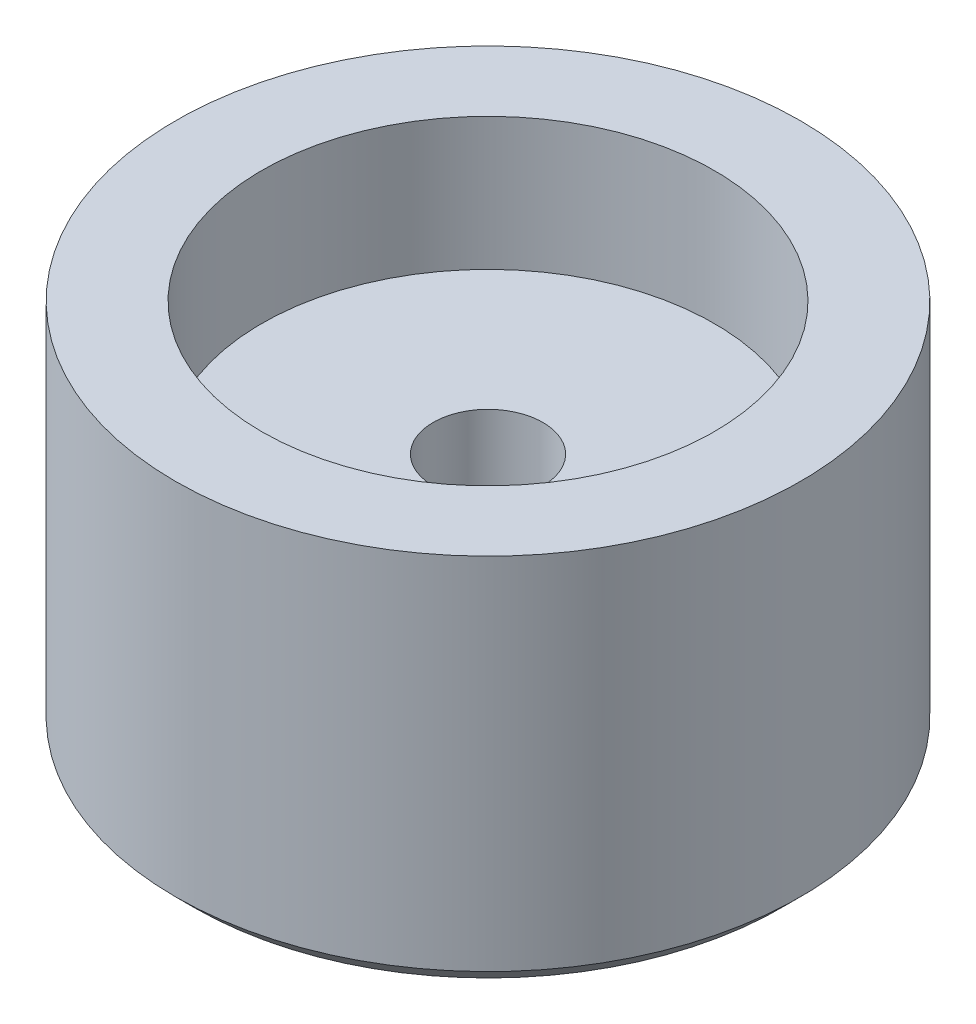
ISO-10303-21;
HEADER;
FILE_DESCRIPTION(('STEP AP214'),'2;1');
FILE_NAME('part.step','',(''),(''),'','','');
FILE_SCHEMA(('AUTOMOTIVE_DESIGN { 1 0 10303 214 1 1 1 1 }'));
ENDSEC;
DATA;
#1=APPLICATION_CONTEXT('core data for automotive mechanical design processes');
#2=APPLICATION_PROTOCOL_DEFINITION('international standard','automotive_design',2000,#1);
#3=PRODUCT_CONTEXT('',#1,'mechanical');
#4=PRODUCT('Part','Part','',(#3));
#5=PRODUCT_RELATED_PRODUCT_CATEGORY('part','',(#4));
#6=PRODUCT_DEFINITION_FORMATION('','',#4);
#7=PRODUCT_DEFINITION_CONTEXT('part definition',#1,'design');
#8=PRODUCT_DEFINITION('design','',#6,#7);
#9=PRODUCT_DEFINITION_SHAPE('','',#8);
#10=(LENGTH_UNIT() NAMED_UNIT(*) SI_UNIT(.MILLI.,.METRE.));
#11=(NAMED_UNIT(*) PLANE_ANGLE_UNIT() SI_UNIT($,.RADIAN.));
#12=(NAMED_UNIT(*) SI_UNIT($,.STERADIAN.) SOLID_ANGLE_UNIT());
#13=UNCERTAINTY_MEASURE_WITH_UNIT(LENGTH_MEASURE(1.E-05),#10,'distance_accuracy_value','');
#14=(GEOMETRIC_REPRESENTATION_CONTEXT(3) GLOBAL_UNCERTAINTY_ASSIGNED_CONTEXT((#13)) GLOBAL_UNIT_ASSIGNED_CONTEXT((#10,
#11,#12)) REPRESENTATION_CONTEXT('',''));
#15=CARTESIAN_POINT('',(0.,0.,0.));
#16=DIRECTION('',(0.,0.,1.));
#17=DIRECTION('',(1.,0.,0.));
#18=AXIS2_PLACEMENT_3D('',#15,#16,#17);
#19=CARTESIAN_POINT('',(0.,10.,0.));
#20=DIRECTION('',(0.,-1.,0.));
#21=DIRECTION('',(0.,0.,-1.));
#22=AXIS2_PLACEMENT_3D('',#19,#20,#21);
#23=CYLINDRICAL_SURFACE('',#22,1.45);
#24=CARTESIAN_POINT('',(0.,0.,0.));
#25=DIRECTION('',(0.,1.,0.));
#26=DIRECTION('',(0.,0.,1.));
#27=AXIS2_PLACEMENT_3D('',#24,#25,#26);
#28=CIRCLE('',#27,1.45);
#29=CARTESIAN_POINT('',(0.,0.,1.45));
#30=VERTEX_POINT('',#29);
#31=EDGE_CURVE('E64',#30,#30,#28,.T.);
#32=ORIENTED_EDGE('',*,*,#31,.F.);
#33=EDGE_LOOP('',(#32));
#34=FACE_BOUND('',#33,.T.);
#35=CARTESIAN_POINT('',(0.,6.5,0.));
#36=DIRECTION('',(0.,1.,0.));
#37=DIRECTION('',(0.,0.,1.));
#38=AXIS2_PLACEMENT_3D('',#35,#36,#37);
#39=CIRCLE('',#38,1.45);
#40=CARTESIAN_POINT('',(0.,6.5,1.45));
#41=VERTEX_POINT('',#40);
#42=EDGE_CURVE('E67',#41,#41,#39,.T.);
#43=ORIENTED_EDGE('',*,*,#42,.T.);
#44=EDGE_LOOP('',(#43));
#45=FACE_BOUND('',#44,.T.);
#46=ADVANCED_FACE('F42',(#34,#45),#23,.F.);
#47=CARTESIAN_POINT('',(0.,10.,0.));
#48=DIRECTION('',(0.,1.,0.));
#49=DIRECTION('',(0.,0.,1.));
#50=AXIS2_PLACEMENT_3D('',#47,#48,#49);
#51=PLANE('',#50);
#52=CARTESIAN_POINT('',(0.,10.,0.));
#53=DIRECTION('',(0.,1.,0.));
#54=DIRECTION('',(0.,0.,1.));
#55=AXIS2_PLACEMENT_3D('',#52,#53,#54);
#56=CIRCLE('',#55,5.975);
#57=CARTESIAN_POINT('',(0.,10.,5.975));
#58=VERTEX_POINT('',#57);
#59=EDGE_CURVE('E73',#58,#58,#56,.T.);
#60=ORIENTED_EDGE('',*,*,#59,.F.);
#61=EDGE_LOOP('',(#60));
#62=FACE_BOUND('',#61,.T.);
#63=CARTESIAN_POINT('',(0.,10.,0.));
#64=DIRECTION('',(0.,1.,0.));
#65=DIRECTION('',(0.,0.,1.));
#66=AXIS2_PLACEMENT_3D('',#63,#64,#65);
#67=CIRCLE('',#66,8.25);
#68=CARTESIAN_POINT('',(0.,10.,8.25));
#69=VERTEX_POINT('',#68);
#70=EDGE_CURVE('E58',#69,#69,#67,.T.);
#71=ORIENTED_EDGE('',*,*,#70,.T.);
#72=EDGE_LOOP('',(#71));
#73=FACE_BOUND('',#72,.T.);
#74=ADVANCED_FACE('F89',(#62,#73),#51,.T.);
#75=CARTESIAN_POINT('',(0.,0.,0.));
#76=DIRECTION('',(0.,1.,0.));
#77=DIRECTION('',(0.,0.,1.));
#78=AXIS2_PLACEMENT_3D('',#75,#76,#77);
#79=PLANE('',#78);
#80=CARTESIAN_POINT('',(0.,0.,0.));
#81=DIRECTION('',(0.,1.,0.));
#82=DIRECTION('',(0.,0.,1.));
#83=AXIS2_PLACEMENT_3D('',#80,#81,#82);
#84=CIRCLE('',#83,7.75);
#85=CARTESIAN_POINT('',(0.,0.,7.75));
#86=VERTEX_POINT('',#85);
#87=EDGE_CURVE('E10',#86,#86,#84,.F.);
#88=ORIENTED_EDGE('',*,*,#87,.T.);
#89=EDGE_LOOP('',(#88));
#90=FACE_BOUND('',#89,.T.);
#91=ORIENTED_EDGE('',*,*,#31,.T.);
#92=EDGE_LOOP('',(#91));
#93=FACE_BOUND('',#92,.T.);
#94=ADVANCED_FACE('F92',(#90,#93),#79,.F.);
#95=CARTESIAN_POINT('',(0.,10.,0.));
#96=DIRECTION('',(0.,-1.,0.));
#97=DIRECTION('',(0.,0.,-1.));
#98=AXIS2_PLACEMENT_3D('',#95,#96,#97);
#99=CYLINDRICAL_SURFACE('',#98,8.25);
#100=CARTESIAN_POINT('',(0.,0.500000000000004,0.));
#101=DIRECTION('',(0.,1.,0.));
#102=DIRECTION('',(0.,0.,1.));
#103=AXIS2_PLACEMENT_3D('',#100,#101,#102);
#104=CIRCLE('',#103,8.25);
#105=CARTESIAN_POINT('',(0.,0.500000000000004,8.25));
#106=VERTEX_POINT('',#105);
#107=EDGE_CURVE('E51',#106,#106,#104,.T.);
#108=ORIENTED_EDGE('',*,*,#107,.T.);
#109=EDGE_LOOP('',(#108));
#110=FACE_BOUND('',#109,.T.);
#111=ORIENTED_EDGE('',*,*,#70,.F.);
#112=EDGE_LOOP('',(#111));
#113=FACE_BOUND('',#112,.T.);
#114=ADVANCED_FACE('F85',(#110,#113),#99,.T.);
#115=CARTESIAN_POINT('',(0.,6.5,0.));
#116=DIRECTION('',(0.,1.,0.));
#117=DIRECTION('',(0.,0.,1.));
#118=AXIS2_PLACEMENT_3D('',#115,#116,#117);
#119=CYLINDRICAL_SURFACE('',#118,5.975);
#120=CARTESIAN_POINT('',(0.,6.5,0.));
#121=DIRECTION('',(0.,1.,0.));
#122=DIRECTION('',(0.,0.,1.));
#123=AXIS2_PLACEMENT_3D('',#120,#121,#122);
#124=CIRCLE('',#123,5.975);
#125=CARTESIAN_POINT('',(0.,6.5,5.975));
#126=VERTEX_POINT('',#125);
#127=EDGE_CURVE('E69',#126,#126,#124,.T.);
#128=ORIENTED_EDGE('',*,*,#127,.F.);
#129=EDGE_LOOP('',(#128));
#130=FACE_BOUND('',#129,.T.);
#131=ORIENTED_EDGE('',*,*,#59,.T.);
#132=EDGE_LOOP('',(#131));
#133=FACE_BOUND('',#132,.T.);
#134=ADVANCED_FACE('F82',(#130,#133),#119,.F.);
#135=CARTESIAN_POINT('',(0.,6.5,0.));
#136=DIRECTION('',(0.,1.,0.));
#137=DIRECTION('',(0.,0.,1.));
#138=AXIS2_PLACEMENT_3D('',#135,#136,#137);
#139=PLANE('',#138);
#140=ORIENTED_EDGE('',*,*,#42,.F.);
#141=EDGE_LOOP('',(#140));
#142=FACE_BOUND('',#141,.T.);
#143=ORIENTED_EDGE('',*,*,#127,.T.);
#144=EDGE_LOOP('',(#143));
#145=FACE_BOUND('',#144,.T.);
#146=ADVANCED_FACE('F80',(#142,#145),#139,.T.);
#147=CARTESIAN_POINT('',(0.,0.500000000000004,0.));
#148=DIRECTION('',(0.,1.,0.));
#149=DIRECTION('',(0.,0.,1.));
#150=AXIS2_PLACEMENT_3D('',#147,#148,#149);
#151=CONICAL_SURFACE('',#150,8.25,0.785398163397448);
#152=ORIENTED_EDGE('',*,*,#87,.F.);
#153=EDGE_LOOP('',(#152));
#154=FACE_BOUND('',#153,.T.);
#155=ORIENTED_EDGE('',*,*,#107,.F.);
#156=EDGE_LOOP('',(#155));
#157=FACE_BOUND('',#156,.T.);
#158=ADVANCED_FACE('F45',(#154,#157),#151,.T.);
#159=CLOSED_SHELL('',(#46,#74,#94,#114,#134,#146,#158));
#160=MANIFOLD_SOLID_BREP('B2',#159);
#161=ADVANCED_BREP_SHAPE_REPRESENTATION('',(#18,#160),#14);
#162=SHAPE_DEFINITION_REPRESENTATION(#9,#161);
ENDSEC;
END-ISO-10303-21;
